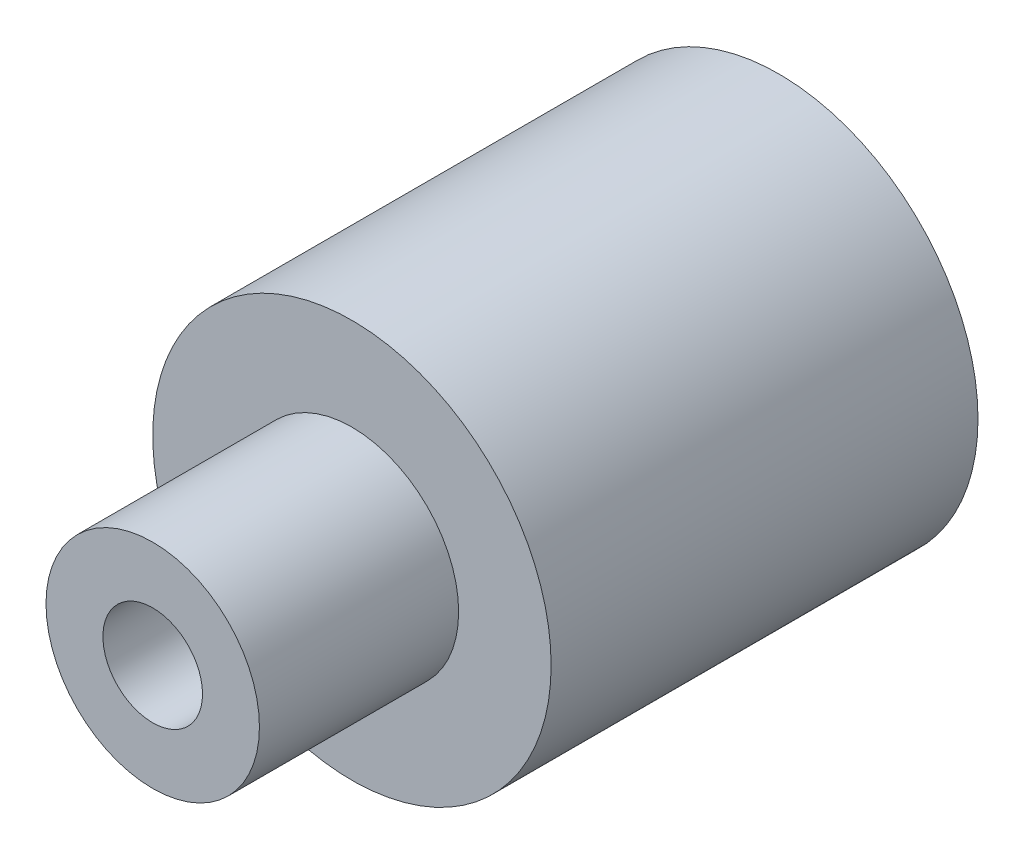
ISO-10303-21;
HEADER;
FILE_DESCRIPTION(('STEP AP214'),'2;1');
FILE_NAME('part.step','',(''),(''),'','','');
FILE_SCHEMA(('AUTOMOTIVE_DESIGN { 1 0 10303 214 1 1 1 1 }'));
ENDSEC;
DATA;
#1=APPLICATION_CONTEXT('core data for automotive mechanical design processes');
#2=APPLICATION_PROTOCOL_DEFINITION('international standard','automotive_design',2000,#1);
#3=PRODUCT_CONTEXT('',#1,'mechanical');
#4=PRODUCT('Part','Part','',(#3));
#5=PRODUCT_RELATED_PRODUCT_CATEGORY('part','',(#4));
#6=PRODUCT_DEFINITION_FORMATION('','',#4);
#7=PRODUCT_DEFINITION_CONTEXT('part definition',#1,'design');
#8=PRODUCT_DEFINITION('design','',#6,#7);
#9=PRODUCT_DEFINITION_SHAPE('','',#8);
#10=(LENGTH_UNIT() NAMED_UNIT(*) SI_UNIT(.MILLI.,.METRE.));
#11=(NAMED_UNIT(*) PLANE_ANGLE_UNIT() SI_UNIT($,.RADIAN.));
#12=(NAMED_UNIT(*) SI_UNIT($,.STERADIAN.) SOLID_ANGLE_UNIT());
#13=UNCERTAINTY_MEASURE_WITH_UNIT(LENGTH_MEASURE(1.E-05),#10,'distance_accuracy_value','');
#14=(GEOMETRIC_REPRESENTATION_CONTEXT(3) GLOBAL_UNCERTAINTY_ASSIGNED_CONTEXT((#13)) GLOBAL_UNIT_ASSIGNED_CONTEXT((#10,
#11,#12)) REPRESENTATION_CONTEXT('',''));
#15=CARTESIAN_POINT('',(0.,0.,0.));
#16=DIRECTION('',(0.,0.,1.));
#17=DIRECTION('',(1.,0.,0.));
#18=AXIS2_PLACEMENT_3D('',#15,#16,#17);
#19=CARTESIAN_POINT('',(0.,0.,15.));
#20=DIRECTION('',(0.,0.,-1.));
#21=DIRECTION('',(-1.,0.,0.));
#22=AXIS2_PLACEMENT_3D('',#19,#20,#21);
#23=CYLINDRICAL_SURFACE('',#22,7.);
#24=CARTESIAN_POINT('',(0.,0.,15.));
#25=DIRECTION('',(0.,0.,1.));
#26=DIRECTION('',(1.,0.,0.));
#27=AXIS2_PLACEMENT_3D('',#24,#25,#26);
#28=CIRCLE('',#27,7.);
#29=CARTESIAN_POINT('',(7.,0.,15.));
#30=VERTEX_POINT('',#29);
#31=EDGE_CURVE('E51',#30,#30,#28,.T.);
#32=ORIENTED_EDGE('',*,*,#31,.F.);
#33=EDGE_LOOP('',(#32));
#34=FACE_BOUND('',#33,.T.);
#35=CARTESIAN_POINT('',(0.,0.,0.));
#36=DIRECTION('',(0.,0.,1.));
#37=DIRECTION('',(1.,0.,0.));
#38=AXIS2_PLACEMENT_3D('',#35,#36,#37);
#39=CIRCLE('',#38,7.);
#40=CARTESIAN_POINT('',(7.,0.,0.));
#41=VERTEX_POINT('',#40);
#42=EDGE_CURVE('E46',#41,#41,#39,.T.);
#43=ORIENTED_EDGE('',*,*,#42,.T.);
#44=EDGE_LOOP('',(#43));
#45=FACE_BOUND('',#44,.T.);
#46=ADVANCED_FACE('F43',(#34,#45),#23,.T.);
#47=CARTESIAN_POINT('',(0.,0.,15.));
#48=DIRECTION('',(0.,0.,1.));
#49=DIRECTION('',(1.,0.,0.));
#50=AXIS2_PLACEMENT_3D('',#47,#48,#49);
#51=PLANE('',#50);
#52=CARTESIAN_POINT('',(0.,0.,15.));
#53=DIRECTION('',(0.,0.,1.));
#54=DIRECTION('',(1.,0.,0.));
#55=AXIS2_PLACEMENT_3D('',#52,#53,#54);
#56=CIRCLE('',#55,3.75);
#57=CARTESIAN_POINT('',(3.75,0.,15.));
#58=VERTEX_POINT('',#57);
#59=EDGE_CURVE('E10',#58,#58,#56,.T.);
#60=ORIENTED_EDGE('',*,*,#59,.F.);
#61=EDGE_LOOP('',(#60));
#62=FACE_BOUND('',#61,.T.);
#63=ORIENTED_EDGE('',*,*,#31,.T.);
#64=EDGE_LOOP('',(#63));
#65=FACE_BOUND('',#64,.T.);
#66=ADVANCED_FACE('F87',(#62,#65),#51,.T.);
#67=CARTESIAN_POINT('',(0.,0.,0.));
#68=DIRECTION('',(0.,0.,1.));
#69=DIRECTION('',(1.,0.,0.));
#70=AXIS2_PLACEMENT_3D('',#67,#68,#69);
#71=PLANE('',#70);
#72=CARTESIAN_POINT('',(0.,0.,0.));
#73=DIRECTION('',(0.,0.,1.));
#74=DIRECTION('',(1.,0.,0.));
#75=AXIS2_PLACEMENT_3D('',#72,#73,#74);
#76=CIRCLE('',#75,1.75);
#77=CARTESIAN_POINT('',(1.75,0.,0.));
#78=VERTEX_POINT('',#77);
#79=EDGE_CURVE('E62',#78,#78,#76,.F.);
#80=ORIENTED_EDGE('',*,*,#79,.F.);
#81=EDGE_LOOP('',(#80));
#82=FACE_BOUND('',#81,.T.);
#83=ORIENTED_EDGE('',*,*,#42,.F.);
#84=EDGE_LOOP('',(#83));
#85=FACE_BOUND('',#84,.T.);
#86=ADVANCED_FACE('F81',(#82,#85),#71,.F.);
#87=CARTESIAN_POINT('',(0.,0.,22.));
#88=DIRECTION('',(0.,0.,-1.));
#89=DIRECTION('',(-1.,0.,0.));
#90=AXIS2_PLACEMENT_3D('',#87,#88,#89);
#91=CYLINDRICAL_SURFACE('',#90,3.75);
#92=CARTESIAN_POINT('',(0.,0.,22.));
#93=DIRECTION('',(0.,0.,1.));
#94=DIRECTION('',(1.,0.,0.));
#95=AXIS2_PLACEMENT_3D('',#92,#93,#94);
#96=CIRCLE('',#95,3.75);
#97=CARTESIAN_POINT('',(3.75,0.,22.));
#98=VERTEX_POINT('',#97);
#99=EDGE_CURVE('E58',#98,#98,#96,.T.);
#100=ORIENTED_EDGE('',*,*,#99,.F.);
#101=EDGE_LOOP('',(#100));
#102=FACE_BOUND('',#101,.T.);
#103=ORIENTED_EDGE('',*,*,#59,.T.);
#104=EDGE_LOOP('',(#103));
#105=FACE_BOUND('',#104,.T.);
#106=ADVANCED_FACE('F76',(#102,#105),#91,.T.);
#107=CARTESIAN_POINT('',(0.,0.,22.));
#108=DIRECTION('',(0.,0.,1.));
#109=DIRECTION('',(1.,0.,0.));
#110=AXIS2_PLACEMENT_3D('',#107,#108,#109);
#111=PLANE('',#110);
#112=CARTESIAN_POINT('',(0.,0.,22.));
#113=DIRECTION('',(0.,0.,1.));
#114=DIRECTION('',(1.,0.,0.));
#115=AXIS2_PLACEMENT_3D('',#112,#113,#114);
#116=CIRCLE('',#115,1.75);
#117=CARTESIAN_POINT('',(1.75,0.,22.));
#118=VERTEX_POINT('',#117);
#119=EDGE_CURVE('E66',#118,#118,#116,.T.);
#120=ORIENTED_EDGE('',*,*,#119,.F.);
#121=EDGE_LOOP('',(#120));
#122=FACE_BOUND('',#121,.T.);
#123=ORIENTED_EDGE('',*,*,#99,.T.);
#124=EDGE_LOOP('',(#123));
#125=FACE_BOUND('',#124,.T.);
#126=ADVANCED_FACE('F73',(#122,#125),#111,.T.);
#127=CARTESIAN_POINT('',(0.,0.,-4.94974746830584));
#128=DIRECTION('',(0.,0.,1.));
#129=DIRECTION('',(1.,0.,0.));
#130=AXIS2_PLACEMENT_3D('',#127,#128,#129);
#131=CYLINDRICAL_SURFACE('',#130,1.75);
#132=ORIENTED_EDGE('',*,*,#79,.T.);
#133=EDGE_LOOP('',(#132));
#134=FACE_BOUND('',#133,.T.);
#135=ORIENTED_EDGE('',*,*,#119,.T.);
#136=EDGE_LOOP('',(#135));
#137=FACE_BOUND('',#136,.T.);
#138=ADVANCED_FACE('F71',(#134,#137),#131,.F.);
#139=CLOSED_SHELL('',(#46,#66,#86,#106,#126,#138));
#140=MANIFOLD_SOLID_BREP('B2',#139);
#141=ADVANCED_BREP_SHAPE_REPRESENTATION('',(#18,#140),#14);
#142=SHAPE_DEFINITION_REPRESENTATION(#9,#141);
ENDSEC;
END-ISO-10303-21;
